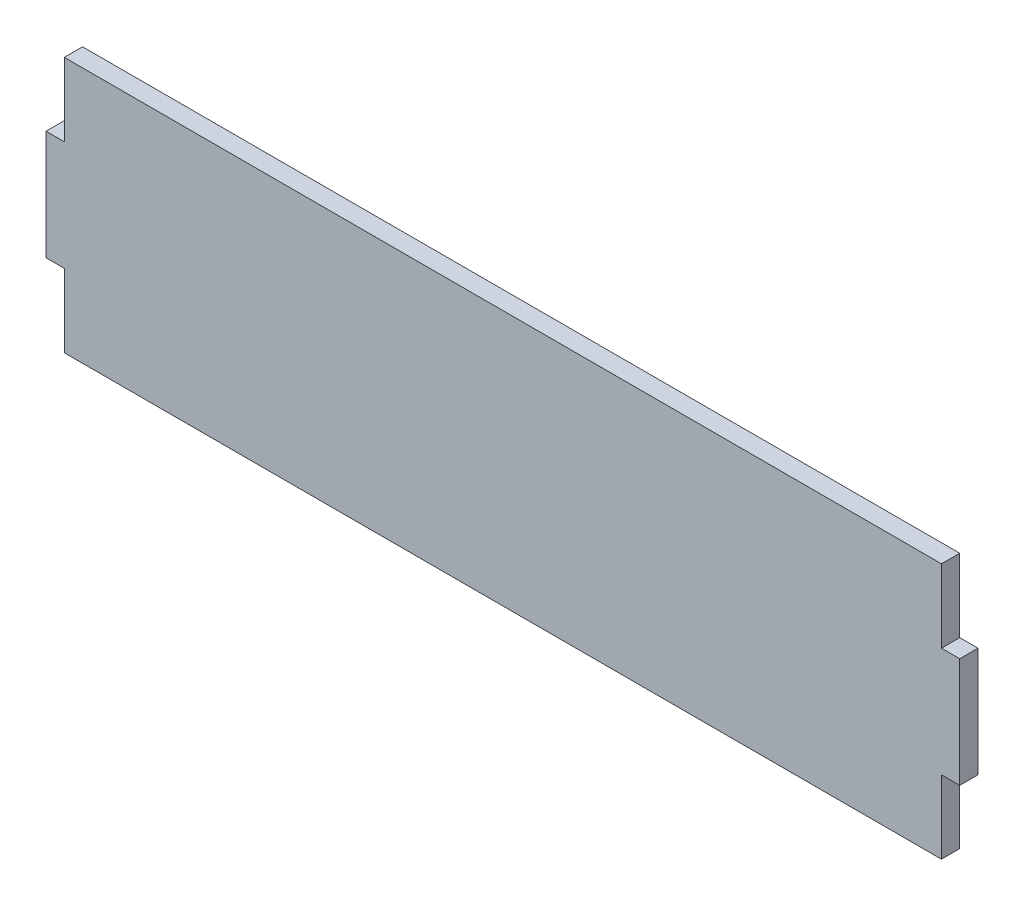
ISO-10303-21;
HEADER;
FILE_DESCRIPTION(('STEP AP214'),'2;1');
FILE_NAME('part.step','',(''),(''),'','','');
FILE_SCHEMA(('AUTOMOTIVE_DESIGN { 1 0 10303 214 1 1 1 1 }'));
ENDSEC;
DATA;
#1=APPLICATION_CONTEXT('core data for automotive mechanical design processes');
#2=APPLICATION_PROTOCOL_DEFINITION('international standard','automotive_design',2000,#1);
#3=PRODUCT_CONTEXT('',#1,'mechanical');
#4=PRODUCT('Part','Part','',(#3));
#5=PRODUCT_RELATED_PRODUCT_CATEGORY('part','',(#4));
#6=PRODUCT_DEFINITION_FORMATION('','',#4);
#7=PRODUCT_DEFINITION_CONTEXT('part definition',#1,'design');
#8=PRODUCT_DEFINITION('design','',#6,#7);
#9=PRODUCT_DEFINITION_SHAPE('','',#8);
#10=(LENGTH_UNIT() NAMED_UNIT(*) SI_UNIT(.MILLI.,.METRE.));
#11=(NAMED_UNIT(*) PLANE_ANGLE_UNIT() SI_UNIT($,.RADIAN.));
#12=(NAMED_UNIT(*) SI_UNIT($,.STERADIAN.) SOLID_ANGLE_UNIT());
#13=UNCERTAINTY_MEASURE_WITH_UNIT(LENGTH_MEASURE(1.E-05),#10,'distance_accuracy_value','');
#14=(GEOMETRIC_REPRESENTATION_CONTEXT(3) GLOBAL_UNCERTAINTY_ASSIGNED_CONTEXT((#13)) GLOBAL_UNIT_ASSIGNED_CONTEXT((#10,
#11,#12)) REPRESENTATION_CONTEXT('',''));
#15=CARTESIAN_POINT('',(0.,0.,0.));
#16=DIRECTION('',(0.,0.,1.));
#17=DIRECTION('',(1.,0.,0.));
#18=AXIS2_PLACEMENT_3D('',#15,#16,#17);
#19=CARTESIAN_POINT('',(0.,20.,5.));
#20=DIRECTION('',(1.,0.,0.));
#21=DIRECTION('',(0.,1.,0.));
#22=AXIS2_PLACEMENT_3D('',#19,#20,#21);
#23=PLANE('',#22);
#24=DIRECTION('',(0.,-1.,0.));
#25=VECTOR('',#24,1.);
#26=CARTESIAN_POINT('',(0.,20.,0.));
#27=LINE('',#26,#25);
#28=CARTESIAN_POINT('',(0.,20.,0.));
#29=VERTEX_POINT('',#28);
#30=CARTESIAN_POINT('',(0.,0.,0.));
#31=VERTEX_POINT('',#30);
#32=EDGE_CURVE('E164',#29,#31,#27,.T.);
#33=ORIENTED_EDGE('',*,*,#32,.T.);
#34=DIRECTION('',(0.,0.,-1.));
#35=VECTOR('',#34,1.);
#36=CARTESIAN_POINT('',(0.,0.,5.));
#37=LINE('',#36,#35);
#38=CARTESIAN_POINT('',(0.,0.,5.));
#39=VERTEX_POINT('',#38);
#40=EDGE_CURVE('E11',#39,#31,#37,.T.);
#41=ORIENTED_EDGE('',*,*,#40,.F.);
#42=DIRECTION('',(0.,-1.,0.));
#43=VECTOR('',#42,1.);
#44=CARTESIAN_POINT('',(0.,20.,5.));
#45=LINE('',#44,#43);
#46=CARTESIAN_POINT('',(0.,20.,5.));
#47=VERTEX_POINT('',#46);
#48=EDGE_CURVE('E198',#47,#39,#45,.T.);
#49=ORIENTED_EDGE('',*,*,#48,.F.);
#50=DIRECTION('',(0.,0.,-1.));
#51=VECTOR('',#50,1.);
#52=CARTESIAN_POINT('',(0.,20.,5.));
#53=LINE('',#52,#51);
#54=EDGE_CURVE('E160',#47,#29,#53,.T.);
#55=ORIENTED_EDGE('',*,*,#54,.T.);
#56=EDGE_LOOP('',(#33,#41,#49,#55));
#57=FACE_BOUND('',#56,.T.);
#58=ADVANCED_FACE('F38',(#57),#23,.F.);
#59=CARTESIAN_POINT('',(0.,0.,5.));
#60=DIRECTION('',(0.,1.,0.));
#61=DIRECTION('',(0.,0.,1.));
#62=AXIS2_PLACEMENT_3D('',#59,#60,#61);
#63=PLANE('',#62);
#64=DIRECTION('',(1.,0.,0.));
#65=VECTOR('',#64,1.);
#66=CARTESIAN_POINT('',(0.,0.,0.));
#67=LINE('',#66,#65);
#68=CARTESIAN_POINT('',(240.,0.,0.));
#69=VERTEX_POINT('',#68);
#70=EDGE_CURVE('E168',#31,#69,#67,.T.);
#71=ORIENTED_EDGE('',*,*,#70,.T.);
#72=DIRECTION('',(0.,0.,-1.));
#73=VECTOR('',#72,1.);
#74=CARTESIAN_POINT('',(240.,0.,5.));
#75=LINE('',#74,#73);
#76=CARTESIAN_POINT('',(240.,0.,5.));
#77=VERTEX_POINT('',#76);
#78=EDGE_CURVE('E47',#77,#69,#75,.T.);
#79=ORIENTED_EDGE('',*,*,#78,.F.);
#80=DIRECTION('',(1.,0.,0.));
#81=VECTOR('',#80,1.);
#82=CARTESIAN_POINT('',(0.,0.,5.));
#83=LINE('',#82,#81);
#84=EDGE_CURVE('E110',#39,#77,#83,.T.);
#85=ORIENTED_EDGE('',*,*,#84,.F.);
#86=ORIENTED_EDGE('',*,*,#40,.T.);
#87=EDGE_LOOP('',(#71,#79,#85,#86));
#88=FACE_BOUND('',#87,.T.);
#89=ADVANCED_FACE('F299',(#88),#63,.F.);
#90=CARTESIAN_POINT('',(240.,0.,5.));
#91=DIRECTION('',(-1.,0.,0.));
#92=DIRECTION('',(0.,0.,1.));
#93=AXIS2_PLACEMENT_3D('',#90,#91,#92);
#94=PLANE('',#93);
#95=DIRECTION('',(0.,1.,0.));
#96=VECTOR('',#95,1.);
#97=CARTESIAN_POINT('',(240.,0.,0.));
#98=LINE('',#97,#96);
#99=CARTESIAN_POINT('',(240.,20.,0.));
#100=VERTEX_POINT('',#99);
#101=EDGE_CURVE('E171',#69,#100,#98,.T.);
#102=ORIENTED_EDGE('',*,*,#101,.T.);
#103=DIRECTION('',(0.,0.,-1.));
#104=VECTOR('',#103,1.);
#105=CARTESIAN_POINT('',(240.,20.,5.));
#106=LINE('',#105,#104);
#107=CARTESIAN_POINT('',(240.,20.,5.));
#108=VERTEX_POINT('',#107);
#109=EDGE_CURVE('E225',#108,#100,#106,.T.);
#110=ORIENTED_EDGE('',*,*,#109,.F.);
#111=DIRECTION('',(0.,1.,0.));
#112=VECTOR('',#111,1.);
#113=CARTESIAN_POINT('',(240.,0.,5.));
#114=LINE('',#113,#112);
#115=EDGE_CURVE('E236',#77,#108,#114,.T.);
#116=ORIENTED_EDGE('',*,*,#115,.F.);
#117=ORIENTED_EDGE('',*,*,#78,.T.);
#118=EDGE_LOOP('',(#102,#110,#116,#117));
#119=FACE_BOUND('',#118,.T.);
#120=ADVANCED_FACE('F234',(#119),#94,.F.);
#121=CARTESIAN_POINT('',(240.,20.,5.));
#122=DIRECTION('',(0.,1.,0.));
#123=DIRECTION('',(0.,0.,1.));
#124=AXIS2_PLACEMENT_3D('',#121,#122,#123);
#125=PLANE('',#124);
#126=DIRECTION('',(1.,0.,0.));
#127=VECTOR('',#126,1.);
#128=CARTESIAN_POINT('',(240.,20.,0.));
#129=LINE('',#128,#127);
#130=CARTESIAN_POINT('',(245.,20.,0.));
#131=VERTEX_POINT('',#130);
#132=EDGE_CURVE('E174',#100,#131,#129,.T.);
#133=ORIENTED_EDGE('',*,*,#132,.T.);
#134=DIRECTION('',(0.,0.,-1.));
#135=VECTOR('',#134,1.);
#136=CARTESIAN_POINT('',(245.,20.,5.));
#137=LINE('',#136,#135);
#138=CARTESIAN_POINT('',(245.,20.,5.));
#139=VERTEX_POINT('',#138);
#140=EDGE_CURVE('E221',#139,#131,#137,.T.);
#141=ORIENTED_EDGE('',*,*,#140,.F.);
#142=DIRECTION('',(1.,0.,0.));
#143=VECTOR('',#142,1.);
#144=CARTESIAN_POINT('',(240.,20.,5.));
#145=LINE('',#144,#143);
#146=EDGE_CURVE('E255',#108,#139,#145,.T.);
#147=ORIENTED_EDGE('',*,*,#146,.F.);
#148=ORIENTED_EDGE('',*,*,#109,.T.);
#149=EDGE_LOOP('',(#133,#141,#147,#148));
#150=FACE_BOUND('',#149,.T.);
#151=ADVANCED_FACE('F245',(#150),#125,.F.);
#152=CARTESIAN_POINT('',(245.,20.,5.));
#153=DIRECTION('',(-1.,0.,0.));
#154=DIRECTION('',(0.,0.,1.));
#155=AXIS2_PLACEMENT_3D('',#152,#153,#154);
#156=PLANE('',#155);
#157=DIRECTION('',(0.,1.,0.));
#158=VECTOR('',#157,1.);
#159=CARTESIAN_POINT('',(245.,20.,0.));
#160=LINE('',#159,#158);
#161=CARTESIAN_POINT('',(245.,50.,0.));
#162=VERTEX_POINT('',#161);
#163=EDGE_CURVE('E177',#131,#162,#160,.T.);
#164=ORIENTED_EDGE('',*,*,#163,.T.);
#165=DIRECTION('',(0.,0.,-1.));
#166=VECTOR('',#165,1.);
#167=CARTESIAN_POINT('',(245.,50.,5.));
#168=LINE('',#167,#166);
#169=CARTESIAN_POINT('',(245.,50.,5.));
#170=VERTEX_POINT('',#169);
#171=EDGE_CURVE('E217',#170,#162,#168,.T.);
#172=ORIENTED_EDGE('',*,*,#171,.F.);
#173=DIRECTION('',(0.,1.,0.));
#174=VECTOR('',#173,1.);
#175=CARTESIAN_POINT('',(245.,20.,5.));
#176=LINE('',#175,#174);
#177=EDGE_CURVE('E251',#139,#170,#176,.T.);
#178=ORIENTED_EDGE('',*,*,#177,.F.);
#179=ORIENTED_EDGE('',*,*,#140,.T.);
#180=EDGE_LOOP('',(#164,#172,#178,#179));
#181=FACE_BOUND('',#180,.T.);
#182=ADVANCED_FACE('F249',(#181),#156,.F.);
#183=CARTESIAN_POINT('',(245.,50.,5.));
#184=DIRECTION('',(0.,-1.,0.));
#185=DIRECTION('',(0.,0.,-1.));
#186=AXIS2_PLACEMENT_3D('',#183,#184,#185);
#187=PLANE('',#186);
#188=DIRECTION('',(-1.,0.,0.));
#189=VECTOR('',#188,1.);
#190=CARTESIAN_POINT('',(245.,50.,0.));
#191=LINE('',#190,#189);
#192=CARTESIAN_POINT('',(240.,50.,0.));
#193=VERTEX_POINT('',#192);
#194=EDGE_CURVE('E180',#162,#193,#191,.T.);
#195=ORIENTED_EDGE('',*,*,#194,.T.);
#196=DIRECTION('',(0.,0.,-1.));
#197=VECTOR('',#196,1.);
#198=CARTESIAN_POINT('',(240.,50.,5.));
#199=LINE('',#198,#197);
#200=CARTESIAN_POINT('',(240.,50.,5.));
#201=VERTEX_POINT('',#200);
#202=EDGE_CURVE('E213',#201,#193,#199,.T.);
#203=ORIENTED_EDGE('',*,*,#202,.F.);
#204=DIRECTION('',(-1.,0.,0.));
#205=VECTOR('',#204,1.);
#206=CARTESIAN_POINT('',(245.,50.,5.));
#207=LINE('',#206,#205);
#208=EDGE_CURVE('E254',#170,#201,#207,.T.);
#209=ORIENTED_EDGE('',*,*,#208,.F.);
#210=ORIENTED_EDGE('',*,*,#171,.T.);
#211=EDGE_LOOP('',(#195,#203,#209,#210));
#212=FACE_BOUND('',#211,.T.);
#213=ADVANCED_FACE('F312',(#212),#187,.F.);
#214=CARTESIAN_POINT('',(240.,50.,5.));
#215=DIRECTION('',(-1.,0.,0.));
#216=DIRECTION('',(0.,0.,1.));
#217=AXIS2_PLACEMENT_3D('',#214,#215,#216);
#218=PLANE('',#217);
#219=DIRECTION('',(0.,1.,0.));
#220=VECTOR('',#219,1.);
#221=CARTESIAN_POINT('',(240.,50.,0.));
#222=LINE('',#221,#220);
#223=CARTESIAN_POINT('',(240.,70.,0.));
#224=VERTEX_POINT('',#223);
#225=EDGE_CURVE('E183',#193,#224,#222,.T.);
#226=ORIENTED_EDGE('',*,*,#225,.T.);
#227=DIRECTION('',(0.,0.,-1.));
#228=VECTOR('',#227,1.);
#229=CARTESIAN_POINT('',(240.,70.,5.));
#230=LINE('',#229,#228);
#231=CARTESIAN_POINT('',(240.,70.,5.));
#232=VERTEX_POINT('',#231);
#233=EDGE_CURVE('E209',#232,#224,#230,.T.);
#234=ORIENTED_EDGE('',*,*,#233,.F.);
#235=DIRECTION('',(0.,1.,0.));
#236=VECTOR('',#235,1.);
#237=CARTESIAN_POINT('',(240.,50.,5.));
#238=LINE('',#237,#236);
#239=EDGE_CURVE('E260',#201,#232,#238,.T.);
#240=ORIENTED_EDGE('',*,*,#239,.F.);
#241=ORIENTED_EDGE('',*,*,#202,.T.);
#242=EDGE_LOOP('',(#226,#234,#240,#241));
#243=FACE_BOUND('',#242,.T.);
#244=ADVANCED_FACE('F315',(#243),#218,.F.);
#245=CARTESIAN_POINT('',(240.,70.,5.));
#246=DIRECTION('',(0.,-1.,0.));
#247=DIRECTION('',(1.,0.,0.));
#248=AXIS2_PLACEMENT_3D('',#245,#246,#247);
#249=PLANE('',#248);
#250=DIRECTION('',(-1.,0.,0.));
#251=VECTOR('',#250,1.);
#252=CARTESIAN_POINT('',(240.,70.,0.));
#253=LINE('',#252,#251);
#254=CARTESIAN_POINT('',(0.,70.,0.));
#255=VERTEX_POINT('',#254);
#256=EDGE_CURVE('E186',#224,#255,#253,.T.);
#257=ORIENTED_EDGE('',*,*,#256,.T.);
#258=DIRECTION('',(0.,0.,-1.));
#259=VECTOR('',#258,1.);
#260=CARTESIAN_POINT('',(0.,70.,5.));
#261=LINE('',#260,#259);
#262=CARTESIAN_POINT('',(0.,70.,5.));
#263=VERTEX_POINT('',#262);
#264=EDGE_CURVE('E205',#263,#255,#261,.T.);
#265=ORIENTED_EDGE('',*,*,#264,.F.);
#266=DIRECTION('',(-1.,0.,0.));
#267=VECTOR('',#266,1.);
#268=CARTESIAN_POINT('',(240.,70.,5.));
#269=LINE('',#268,#267);
#270=EDGE_CURVE('E267',#232,#263,#269,.T.);
#271=ORIENTED_EDGE('',*,*,#270,.F.);
#272=ORIENTED_EDGE('',*,*,#233,.T.);
#273=EDGE_LOOP('',(#257,#265,#271,#272));
#274=FACE_BOUND('',#273,.T.);
#275=ADVANCED_FACE('F280',(#274),#249,.F.);
#276=CARTESIAN_POINT('',(0.,70.,5.));
#277=DIRECTION('',(1.,0.,0.));
#278=DIRECTION('',(0.,1.,0.));
#279=AXIS2_PLACEMENT_3D('',#276,#277,#278);
#280=PLANE('',#279);
#281=DIRECTION('',(0.,-1.,0.));
#282=VECTOR('',#281,1.);
#283=CARTESIAN_POINT('',(0.,70.,0.));
#284=LINE('',#283,#282);
#285=CARTESIAN_POINT('',(0.,50.,0.));
#286=VERTEX_POINT('',#285);
#287=EDGE_CURVE('E189',#255,#286,#284,.T.);
#288=ORIENTED_EDGE('',*,*,#287,.T.);
#289=DIRECTION('',(0.,0.,-1.));
#290=VECTOR('',#289,1.);
#291=CARTESIAN_POINT('',(0.,50.,5.));
#292=LINE('',#291,#290);
#293=CARTESIAN_POINT('',(0.,50.,5.));
#294=VERTEX_POINT('',#293);
#295=EDGE_CURVE('E152',#294,#286,#292,.T.);
#296=ORIENTED_EDGE('',*,*,#295,.F.);
#297=DIRECTION('',(0.,-1.,0.));
#298=VECTOR('',#297,1.);
#299=CARTESIAN_POINT('',(0.,70.,5.));
#300=LINE('',#299,#298);
#301=EDGE_CURVE('E141',#263,#294,#300,.T.);
#302=ORIENTED_EDGE('',*,*,#301,.F.);
#303=ORIENTED_EDGE('',*,*,#264,.T.);
#304=EDGE_LOOP('',(#288,#296,#302,#303));
#305=FACE_BOUND('',#304,.T.);
#306=ADVANCED_FACE('F284',(#305),#280,.F.);
#307=CARTESIAN_POINT('',(0.,50.,5.));
#308=DIRECTION('',(0.,-1.,0.));
#309=DIRECTION('',(1.,0.,0.));
#310=AXIS2_PLACEMENT_3D('',#307,#308,#309);
#311=PLANE('',#310);
#312=DIRECTION('',(-1.,0.,0.));
#313=VECTOR('',#312,1.);
#314=CARTESIAN_POINT('',(0.,50.,0.));
#315=LINE('',#314,#313);
#316=CARTESIAN_POINT('',(-5.,50.,0.));
#317=VERTEX_POINT('',#316);
#318=EDGE_CURVE('E150',#286,#317,#315,.T.);
#319=ORIENTED_EDGE('',*,*,#318,.T.);
#320=DIRECTION('',(0.,0.,-1.));
#321=VECTOR('',#320,1.);
#322=CARTESIAN_POINT('',(-5.,50.,5.));
#323=LINE('',#322,#321);
#324=CARTESIAN_POINT('',(-5.,50.,5.));
#325=VERTEX_POINT('',#324);
#326=EDGE_CURVE('E147',#325,#317,#323,.T.);
#327=ORIENTED_EDGE('',*,*,#326,.F.);
#328=DIRECTION('',(-1.,0.,0.));
#329=VECTOR('',#328,1.);
#330=CARTESIAN_POINT('',(0.,50.,5.));
#331=LINE('',#330,#329);
#332=EDGE_CURVE('E135',#294,#325,#331,.T.);
#333=ORIENTED_EDGE('',*,*,#332,.F.);
#334=ORIENTED_EDGE('',*,*,#295,.T.);
#335=EDGE_LOOP('',(#319,#327,#333,#334));
#336=FACE_BOUND('',#335,.T.);
#337=ADVANCED_FACE('F148',(#336),#311,.F.);
#338=CARTESIAN_POINT('',(-5.,50.,5.));
#339=DIRECTION('',(1.,0.,0.));
#340=DIRECTION('',(0.,1.,0.));
#341=AXIS2_PLACEMENT_3D('',#338,#339,#340);
#342=PLANE('',#341);
#343=DIRECTION('',(0.,-1.,0.));
#344=VECTOR('',#343,1.);
#345=CARTESIAN_POINT('',(-5.,50.,0.));
#346=LINE('',#345,#344);
#347=CARTESIAN_POINT('',(-5.,20.,0.));
#348=VERTEX_POINT('',#347);
#349=EDGE_CURVE('E96',#317,#348,#346,.T.);
#350=ORIENTED_EDGE('',*,*,#349,.T.);
#351=DIRECTION('',(0.,0.,-1.));
#352=VECTOR('',#351,1.);
#353=CARTESIAN_POINT('',(-5.,20.,5.));
#354=LINE('',#353,#352);
#355=CARTESIAN_POINT('',(-5.,20.,5.));
#356=VERTEX_POINT('',#355);
#357=EDGE_CURVE('E153',#356,#348,#354,.T.);
#358=ORIENTED_EDGE('',*,*,#357,.F.);
#359=DIRECTION('',(0.,-1.,0.));
#360=VECTOR('',#359,1.);
#361=CARTESIAN_POINT('',(-5.,50.,5.));
#362=LINE('',#361,#360);
#363=EDGE_CURVE('E139',#325,#356,#362,.T.);
#364=ORIENTED_EDGE('',*,*,#363,.F.);
#365=ORIENTED_EDGE('',*,*,#326,.T.);
#366=EDGE_LOOP('',(#350,#358,#364,#365));
#367=FACE_BOUND('',#366,.T.);
#368=ADVANCED_FACE('F155',(#367),#342,.F.);
#369=CARTESIAN_POINT('',(-5.,20.,5.));
#370=DIRECTION('',(0.,1.,0.));
#371=DIRECTION('',(0.,0.,1.));
#372=AXIS2_PLACEMENT_3D('',#369,#370,#371);
#373=PLANE('',#372);
#374=DIRECTION('',(1.,0.,0.));
#375=VECTOR('',#374,1.);
#376=CARTESIAN_POINT('',(-5.,20.,0.));
#377=LINE('',#376,#375);
#378=EDGE_CURVE('E102',#348,#29,#377,.T.);
#379=ORIENTED_EDGE('',*,*,#378,.T.);
#380=ORIENTED_EDGE('',*,*,#54,.F.);
#381=DIRECTION('',(1.,0.,0.));
#382=VECTOR('',#381,1.);
#383=CARTESIAN_POINT('',(-5.,20.,5.));
#384=LINE('',#383,#382);
#385=EDGE_CURVE('E55',#356,#47,#384,.T.);
#386=ORIENTED_EDGE('',*,*,#385,.F.);
#387=ORIENTED_EDGE('',*,*,#357,.T.);
#388=EDGE_LOOP('',(#379,#380,#386,#387));
#389=FACE_BOUND('',#388,.T.);
#390=ADVANCED_FACE('F288',(#389),#373,.F.);
#391=CARTESIAN_POINT('',(0.,0.,5.));
#392=DIRECTION('',(0.,0.,1.));
#393=DIRECTION('',(1.,0.,0.));
#394=AXIS2_PLACEMENT_3D('',#391,#392,#393);
#395=PLANE('',#394);
#396=ORIENTED_EDGE('',*,*,#48,.T.);
#397=ORIENTED_EDGE('',*,*,#84,.T.);
#398=ORIENTED_EDGE('',*,*,#115,.T.);
#399=ORIENTED_EDGE('',*,*,#146,.T.);
#400=ORIENTED_EDGE('',*,*,#177,.T.);
#401=ORIENTED_EDGE('',*,*,#208,.T.);
#402=ORIENTED_EDGE('',*,*,#239,.T.);
#403=ORIENTED_EDGE('',*,*,#270,.T.);
#404=ORIENTED_EDGE('',*,*,#301,.T.);
#405=ORIENTED_EDGE('',*,*,#332,.T.);
#406=ORIENTED_EDGE('',*,*,#363,.T.);
#407=ORIENTED_EDGE('',*,*,#385,.T.);
#408=EDGE_LOOP('',(#396,#397,#398,#399,#400,#401,#402,#403,#404,#405,#406,#407));
#409=FACE_BOUND('',#408,.T.);
#410=ADVANCED_FACE('F137',(#409),#395,.T.);
#411=CARTESIAN_POINT('',(0.,0.,0.));
#412=DIRECTION('',(0.,0.,1.));
#413=DIRECTION('',(1.,0.,0.));
#414=AXIS2_PLACEMENT_3D('',#411,#412,#413);
#415=PLANE('',#414);
#416=ORIENTED_EDGE('',*,*,#32,.F.);
#417=ORIENTED_EDGE('',*,*,#378,.F.);
#418=ORIENTED_EDGE('',*,*,#349,.F.);
#419=ORIENTED_EDGE('',*,*,#318,.F.);
#420=ORIENTED_EDGE('',*,*,#287,.F.);
#421=ORIENTED_EDGE('',*,*,#256,.F.);
#422=ORIENTED_EDGE('',*,*,#225,.F.);
#423=ORIENTED_EDGE('',*,*,#194,.F.);
#424=ORIENTED_EDGE('',*,*,#163,.F.);
#425=ORIENTED_EDGE('',*,*,#132,.F.);
#426=ORIENTED_EDGE('',*,*,#101,.F.);
#427=ORIENTED_EDGE('',*,*,#70,.F.);
#428=EDGE_LOOP('',(#416,#417,#418,#419,#420,#421,#422,#423,#424,#425,#426,#427));
#429=FACE_BOUND('',#428,.T.);
#430=ADVANCED_FACE('F240',(#429),#415,.F.);
#431=CLOSED_SHELL('',(#58,#89,#120,#151,#182,#213,#244,#275,#306,#337,#368,#390,#410,#430));
#432=MANIFOLD_SOLID_BREP('B2',#431);
#433=ADVANCED_BREP_SHAPE_REPRESENTATION('',(#18,#432),#14);
#434=SHAPE_DEFINITION_REPRESENTATION(#9,#433);
ENDSEC;
END-ISO-10303-21;
